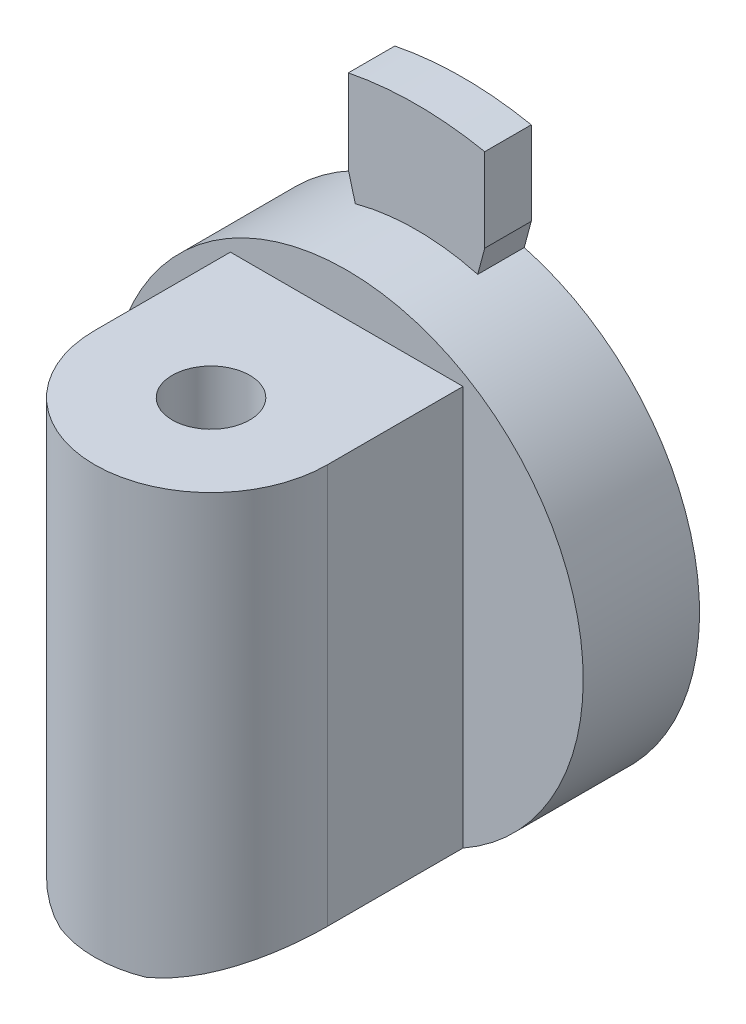
ISO-10303-21;
HEADER;
FILE_DESCRIPTION(('STEP AP214'),'2;1');
FILE_NAME('part.step','',(''),(''),'','','');
FILE_SCHEMA(('AUTOMOTIVE_DESIGN { 1 0 10303 214 1 1 1 1 }'));
ENDSEC;
DATA;
#1=APPLICATION_CONTEXT('core data for automotive mechanical design processes');
#2=APPLICATION_PROTOCOL_DEFINITION('international standard','automotive_design',2000,#1);
#3=PRODUCT_CONTEXT('',#1,'mechanical');
#4=PRODUCT('Part','Part','',(#3));
#5=PRODUCT_RELATED_PRODUCT_CATEGORY('part','',(#4));
#6=PRODUCT_DEFINITION_FORMATION('','',#4);
#7=PRODUCT_DEFINITION_CONTEXT('part definition',#1,'design');
#8=PRODUCT_DEFINITION('design','',#6,#7);
#9=PRODUCT_DEFINITION_SHAPE('','',#8);
#10=(LENGTH_UNIT() NAMED_UNIT(*) SI_UNIT(.MILLI.,.METRE.));
#11=(NAMED_UNIT(*) PLANE_ANGLE_UNIT() SI_UNIT($,.RADIAN.));
#12=(NAMED_UNIT(*) SI_UNIT($,.STERADIAN.) SOLID_ANGLE_UNIT());
#13=UNCERTAINTY_MEASURE_WITH_UNIT(LENGTH_MEASURE(1.E-05),#10,'distance_accuracy_value','');
#14=(GEOMETRIC_REPRESENTATION_CONTEXT(3) GLOBAL_UNCERTAINTY_ASSIGNED_CONTEXT((#13)) GLOBAL_UNIT_ASSIGNED_CONTEXT((#10,
#11,#12)) REPRESENTATION_CONTEXT('',''));
#15=CARTESIAN_POINT('',(0.,0.,0.));
#16=DIRECTION('',(0.,0.,1.));
#17=DIRECTION('',(1.,0.,0.));
#18=AXIS2_PLACEMENT_3D('',#15,#16,#17);
#19=CARTESIAN_POINT('',(0.,-30.5,32.5));
#20=DIRECTION('',(0.,1.,0.));
#21=DIRECTION('',(0.,0.,1.));
#22=AXIS2_PLACEMENT_3D('',#19,#20,#21);
#23=CYLINDRICAL_SURFACE('',#22,5.);
#24=CARTESIAN_POINT('',(0.,-30.,32.5));
#25=DIRECTION('',(0.,1.,0.));
#26=DIRECTION('',(0.,0.,1.));
#27=AXIS2_PLACEMENT_3D('',#24,#25,#26);
#28=CIRCLE('',#27,5.);
#29=CARTESIAN_POINT('',(0.,-30.,37.5));
#30=VERTEX_POINT('',#29);
#31=EDGE_CURVE('E161',#30,#30,#28,.F.);
#32=ORIENTED_EDGE('',*,*,#31,.T.);
#33=EDGE_LOOP('',(#32));
#34=FACE_BOUND('',#33,.T.);
#35=CARTESIAN_POINT('',(0.,25.,32.5));
#36=DIRECTION('',(0.,1.,0.));
#37=DIRECTION('',(0.,0.,1.));
#38=AXIS2_PLACEMENT_3D('',#35,#36,#37);
#39=CIRCLE('',#38,5.);
#40=CARTESIAN_POINT('',(0.,25.,37.5));
#41=VERTEX_POINT('',#40);
#42=EDGE_CURVE('E20',#41,#41,#39,.T.);
#43=ORIENTED_EDGE('',*,*,#42,.T.);
#44=EDGE_LOOP('',(#43));
#45=FACE_BOUND('',#44,.T.);
#46=ADVANCED_FACE('F17',(#34,#45),#23,.F.);
#47=CARTESIAN_POINT('',(-15.,25.,47.5));
#48=DIRECTION('',(0.,-1.,0.));
#49=DIRECTION('',(0.,0.,-1.));
#50=AXIS2_PLACEMENT_3D('',#47,#48,#49);
#51=PLANE('',#50);
#52=DIRECTION('',(1.,0.,0.));
#53=VECTOR('',#52,1.);
#54=CARTESIAN_POINT('',(0.,25.,15.));
#55=LINE('',#54,#53);
#56=CARTESIAN_POINT('',(-15.,25.,15.));
#57=VERTEX_POINT('',#56);
#58=CARTESIAN_POINT('',(15.,25.,15.));
#59=VERTEX_POINT('',#58);
#60=EDGE_CURVE('E159',#57,#59,#55,.T.);
#61=ORIENTED_EDGE('',*,*,#60,.F.);
#62=DIRECTION('',(0.,0.,-1.));
#63=VECTOR('',#62,1.);
#64=CARTESIAN_POINT('',(-15.,25.,47.5));
#65=LINE('',#64,#63);
#66=CARTESIAN_POINT('',(-15.,25.,32.5));
#67=VERTEX_POINT('',#66);
#68=EDGE_CURVE('E206',#57,#67,#65,.F.);
#69=ORIENTED_EDGE('',*,*,#68,.T.);
#70=CARTESIAN_POINT('',(0.,25.,32.5));
#71=DIRECTION('',(0.,-1.,0.));
#72=DIRECTION('',(0.,0.,-1.));
#73=AXIS2_PLACEMENT_3D('',#70,#71,#72);
#74=CIRCLE('',#73,15.);
#75=CARTESIAN_POINT('',(15.,25.,32.5));
#76=VERTEX_POINT('',#75);
#77=EDGE_CURVE('E160',#76,#67,#74,.T.);
#78=ORIENTED_EDGE('',*,*,#77,.F.);
#79=DIRECTION('',(0.,0.,1.));
#80=VECTOR('',#79,1.);
#81=CARTESIAN_POINT('',(15.,25.,47.5));
#82=LINE('',#81,#80);
#83=EDGE_CURVE('E163',#76,#59,#82,.F.);
#84=ORIENTED_EDGE('',*,*,#83,.T.);
#85=EDGE_LOOP('',(#61,#69,#78,#84));
#86=FACE_BOUND('',#85,.T.);
#87=ORIENTED_EDGE('',*,*,#42,.F.);
#88=EDGE_LOOP('',(#87));
#89=FACE_BOUND('',#88,.T.);
#90=ADVANCED_FACE('F252',(#86,#89),#51,.F.);
#91=CARTESIAN_POINT('',(15.,-81.2079095453037,6.));
#92=DIRECTION('',(0.,0.,-1.));
#93=DIRECTION('',(-1.,0.,0.));
#94=AXIS2_PLACEMENT_3D('',#91,#92,#93);
#95=PLANE('',#94);
#96=CARTESIAN_POINT('',(0.,0.,6.));
#97=DIRECTION('',(0.,0.,1.));
#98=DIRECTION('',(1.,0.,0.));
#99=AXIS2_PLACEMENT_3D('',#96,#97,#98);
#100=CIRCLE('',#99,11.5);
#101=CARTESIAN_POINT('',(11.5,0.,6.));
#102=VERTEX_POINT('',#101);
#103=EDGE_CURVE('E156',#102,#102,#100,.F.);
#104=ORIENTED_EDGE('',*,*,#103,.T.);
#105=EDGE_LOOP('',(#104));
#106=FACE_BOUND('',#105,.T.);
#107=ADVANCED_FACE('F421',(#106),#95,.T.);
#108=CARTESIAN_POINT('',(15.,-25.,47.5));
#109=DIRECTION('',(-1.,0.,0.));
#110=DIRECTION('',(0.,0.,1.));
#111=AXIS2_PLACEMENT_3D('',#108,#109,#110);
#112=PLANE('',#111);
#113=DIRECTION('',(0.,1.,0.));
#114=VECTOR('',#113,1.);
#115=CARTESIAN_POINT('',(15.,0.,15.));
#116=LINE('',#115,#114);
#117=CARTESIAN_POINT('',(15.,-26.556543449779,15.));
#118=VERTEX_POINT('',#117);
#119=EDGE_CURVE('E202',#59,#118,#116,.F.);
#120=ORIENTED_EDGE('',*,*,#119,.F.);
#121=ORIENTED_EDGE('',*,*,#83,.F.);
#122=DIRECTION('',(0.,-1.,0.));
#123=VECTOR('',#122,1.);
#124=CARTESIAN_POINT('',(15.,-25.,32.5));
#125=LINE('',#124,#123);
#126=CARTESIAN_POINT('',(15.,-26.556543449779,32.5));
#127=VERTEX_POINT('',#126);
#128=EDGE_CURVE('E113',#127,#76,#125,.F.);
#129=ORIENTED_EDGE('',*,*,#128,.F.);
#130=DIRECTION('',(0.,0.,1.));
#131=VECTOR('',#130,1.);
#132=CARTESIAN_POINT('',(15.,-26.556543449779,-85.5353147287484));
#133=LINE('',#132,#131);
#134=EDGE_CURVE('E151',#118,#127,#133,.T.);
#135=ORIENTED_EDGE('',*,*,#134,.F.);
#136=EDGE_LOOP('',(#120,#121,#129,#135));
#137=FACE_BOUND('',#136,.T.);
#138=ADVANCED_FACE('F208',(#137),#112,.F.);
#139=CARTESIAN_POINT('',(0.,0.,15.));
#140=DIRECTION('',(0.,0.,1.));
#141=DIRECTION('',(1.,0.,0.));
#142=AXIS2_PLACEMENT_3D('',#139,#140,#141);
#143=PLANE('',#142);
#144=DIRECTION('',(1.,0.,0.));
#145=VECTOR('',#144,1.);
#146=CARTESIAN_POINT('',(-15.,-30.,15.));
#147=LINE('',#146,#145);
#148=CARTESIAN_POINT('',(5.49999999999999,-30.,15.));
#149=VERTEX_POINT('',#148);
#150=CARTESIAN_POINT('',(-5.50000000000001,-30.,15.));
#151=VERTEX_POINT('',#150);
#152=EDGE_CURVE('E114',#149,#151,#147,.F.);
#153=ORIENTED_EDGE('',*,*,#152,.T.);
#154=CARTESIAN_POINT('',(0.,0.,15.));
#155=DIRECTION('',(0.,0.,1.));
#156=DIRECTION('',(1.,0.,0.));
#157=AXIS2_PLACEMENT_3D('',#154,#155,#156);
#158=CIRCLE('',#157,30.5);
#159=EDGE_CURVE('E100',#149,#151,#158,.F.);
#160=ORIENTED_EDGE('',*,*,#159,.F.);
#161=EDGE_LOOP('',(#153,#160));
#162=FACE_BOUND('',#161,.T.);
#163=ADVANCED_FACE('F407',(#162),#143,.T.);
#164=CARTESIAN_POINT('',(-15.,-30.,47.5));
#165=DIRECTION('',(0.,1.,0.));
#166=DIRECTION('',(0.,0.,1.));
#167=AXIS2_PLACEMENT_3D('',#164,#165,#166);
#168=PLANE('',#167);
#169=ORIENTED_EDGE('',*,*,#152,.F.);
#170=DIRECTION('',(0.,0.,1.));
#171=VECTOR('',#170,1.);
#172=CARTESIAN_POINT('',(5.49999999999998,-30.,-85.5353147287484));
#173=LINE('',#172,#171);
#174=CARTESIAN_POINT('',(5.49999999999999,-30.,46.4552857369529));
#175=VERTEX_POINT('',#174);
#176=EDGE_CURVE('E109',#175,#149,#173,.F.);
#177=ORIENTED_EDGE('',*,*,#176,.F.);
#178=CARTESIAN_POINT('',(0.,-30.,32.5));
#179=DIRECTION('',(0.,-1.,0.));
#180=DIRECTION('',(0.,0.,-1.));
#181=AXIS2_PLACEMENT_3D('',#178,#179,#180);
#182=CIRCLE('',#181,15.);
#183=CARTESIAN_POINT('',(-5.50000000000001,-30.,46.4552857369529));
#184=VERTEX_POINT('',#183);
#185=EDGE_CURVE('E106',#184,#175,#182,.F.);
#186=ORIENTED_EDGE('',*,*,#185,.F.);
#187=DIRECTION('',(0.,0.,1.));
#188=VECTOR('',#187,1.);
#189=CARTESIAN_POINT('',(-5.50000000000002,-30.,-85.5353147287484));
#190=LINE('',#189,#188);
#191=EDGE_CURVE('E91',#151,#184,#190,.T.);
#192=ORIENTED_EDGE('',*,*,#191,.F.);
#193=EDGE_LOOP('',(#169,#177,#186,#192));
#194=FACE_BOUND('',#193,.T.);
#195=ORIENTED_EDGE('',*,*,#31,.F.);
#196=EDGE_LOOP('',(#195));
#197=FACE_BOUND('',#196,.T.);
#198=ADVANCED_FACE('F107',(#194,#197),#168,.F.);
#199=CARTESIAN_POINT('',(0.,-25.,32.5));
#200=DIRECTION('',(0.,-1.,0.));
#201=DIRECTION('',(0.,0.,-1.));
#202=AXIS2_PLACEMENT_3D('',#199,#200,#201);
#203=CYLINDRICAL_SURFACE('',#202,15.);
#204=DIRECTION('',(0.,1.,0.));
#205=VECTOR('',#204,1.);
#206=CARTESIAN_POINT('',(-15.,-25.,32.5));
#207=LINE('',#206,#205);
#208=CARTESIAN_POINT('',(-15.,-26.556543449779,32.5));
#209=VERTEX_POINT('',#208);
#210=EDGE_CURVE('E118',#67,#209,#207,.F.);
#211=ORIENTED_EDGE('',*,*,#210,.T.);
#212=CARTESIAN_POINT('',(-5.49999999999999,-30.,46.4552857369529));
#213=CARTESIAN_POINT('',(-5.70044985836832,-29.9632528226234,46.3762850100265));
#214=CARTESIAN_POINT('',(-5.89889345198913,-29.9247925311471,46.2930852281892));
#215=CARTESIAN_POINT('',(-6.29147823559979,-29.8447217559978,46.1184969610443));
#216=CARTESIAN_POINT('',(-6.48561976738469,-29.8031115237534,46.0271091292006));
#217=CARTESIAN_POINT('',(-7.06091239412674,-29.6740261090525,45.7411026783285));
#218=CARTESIAN_POINT('',(-7.43523701078017,-29.5822395238018,45.5345204056515));
#219=CARTESIAN_POINT('',(-8.1625106605726,-29.3898747989376,45.0918384437258));
#220=CARTESIAN_POINT('',(-8.5154980358344,-29.289313273663,44.8557941875271));
#221=CARTESIAN_POINT('',(-9.19908617778836,-29.0818568888372,44.3556391888543));
#222=CARTESIAN_POINT('',(-9.52968390522069,-28.9749611731355,44.0915246484606));
#223=CARTESIAN_POINT('',(-10.1661570348007,-28.7578185102687,43.5375241654286));
#224=CARTESIAN_POINT('',(-10.4720777693883,-28.6475782448969,43.2476876326552));
#225=CARTESIAN_POINT('',(-11.0583504910374,-28.4264145970591,42.6434745878344));
#226=CARTESIAN_POINT('',(-11.3387031845262,-28.315491233557,42.3290987542366));
#227=CARTESIAN_POINT('',(-11.8726525672948,-28.0957927821626,41.6770308988742));
#228=CARTESIAN_POINT('',(-12.1262180312078,-27.987020318957,41.3393124090132));
#229=CARTESIAN_POINT('',(-12.6046602008486,-27.7748274075852,40.6425503236751));
#230=CARTESIAN_POINT('',(-12.8295381675375,-27.6714067243001,40.2835076665208));
#231=CARTESIAN_POINT('',(-13.2554739598641,-27.4699769646675,39.5344649560936));
#232=CARTESIAN_POINT('',(-13.455581253173,-27.3722337834306,39.1438511892997));
#233=CARTESIAN_POINT('',(-13.821733707463,-27.1891819657233,38.3440665128642));
#234=CARTESIAN_POINT('',(-13.9877741390536,-27.1038750562148,37.9348930362541));
#235=CARTESIAN_POINT('',(-14.2834948995767,-26.9492039208483,37.1018070341786));
#236=CARTESIAN_POINT('',(-14.4132631740795,-26.8798012086244,36.6779330094969));
#237=CARTESIAN_POINT('',(-14.6351385910958,-26.7596465418452,35.8180896016637));
#238=CARTESIAN_POINT('',(-14.7272679807916,-26.7088835717153,35.3821275266004));
#239=CARTESIAN_POINT('',(-14.8662705636765,-26.6317437671069,34.5396566380537));
#240=CARTESIAN_POINT('',(-14.9163548252856,-26.6036449419356,34.1338398768887));
#241=CARTESIAN_POINT('',(-14.9665033484644,-26.5754416372208,33.5225617200383));
#242=CARTESIAN_POINT('',(-14.9790565482102,-26.5683646851908,33.3183649162622));
#243=CARTESIAN_POINT('',(-14.9958072165998,-26.5589121342893,32.9094552199357));
#244=CARTESIAN_POINT('',(-15.0000020174253,-26.5565380364675,32.7047421834833));
#245=CARTESIAN_POINT('',(-15.,-26.556543449779,32.5));
#246=B_SPLINE_CURVE_WITH_KNOTS('',3,(#212,#213,#214,#215,#216,#217,#218,#219,#220,#221,#222,
#223,#224,#225,#226,#227,#228,#229,#230,#231,#232,#233,#234,#235,#236,#237,#238,#239,#240,#241,
#242,#243,#244,#245),.UNSPECIFIED.,.F.,.F.,(4,2,2,2,2,2,2,2,2,2,2,2,2,2,2,2,4),(0.,
0.6555807362847,1.31110919914286,2.62116971136201,3.92880147213482,5.23661038173218,
6.54195933318409,7.84727220781192,9.15409025063843,10.4608508323729,11.8079824941131,
13.1553010473637,14.4993239773688,15.8425513435751,17.0702417680146,17.6841581877522,
18.2982705248266),.UNSPECIFIED.);
#247=EDGE_CURVE('E96',#184,#209,#246,.T.);
#248=ORIENTED_EDGE('',*,*,#247,.F.);
#249=ORIENTED_EDGE('',*,*,#185,.T.);
#250=CARTESIAN_POINT('',(15.,-26.556543449779,32.5));
#251=CARTESIAN_POINT('',(15.0000014026638,-26.5565390738362,32.6969364044512));
#252=CARTESIAN_POINT('',(14.9961207625379,-26.5587350050204,32.8938451348109));
#253=CARTESIAN_POINT('',(14.9806203400195,-26.5674825610559,33.2872530279762));
#254=CARTESIAN_POINT('',(14.9690008717466,-26.5740340091163,33.4837522070808));
#255=CARTESIAN_POINT('',(14.9225967123751,-26.6001401494794,34.0718043514932));
#256=CARTESIAN_POINT('',(14.8762661766994,-26.6261467846204,34.4622381680938));
#257=CARTESIAN_POINT('',(14.7537894694636,-26.6942039566186,35.2345486714711));
#258=CARTESIAN_POINT('',(14.6778185255595,-26.7361601663379,35.6164619531654));
#259=CARTESIAN_POINT('',(14.4969727664112,-26.8346486110775,36.3714957648628));
#260=CARTESIAN_POINT('',(14.3920948187284,-26.8911824257224,36.7446153371973));
#261=CARTESIAN_POINT('',(14.1548320157859,-27.0168222535819,37.4788855636498));
#262=CARTESIAN_POINT('',(14.0225065630935,-27.0859010770394,37.8400601438407));
#263=CARTESIAN_POINT('',(13.7314461960114,-27.2346116805776,38.5493255395646));
#264=CARTESIAN_POINT('',(13.572711507314,-27.3142433704728,38.897416466879));
#265=CARTESIAN_POINT('',(13.2298066596243,-27.4819701843651,39.5794162586463));
#266=CARTESIAN_POINT('',(13.0455963684955,-27.5700785938852,39.9133016377761));
#267=CARTESIAN_POINT('',(12.6530870268278,-27.752409345025,40.5649951605157));
#268=CARTESIAN_POINT('',(12.4447792424838,-27.8466338978922,40.8827974146518));
#269=CARTESIAN_POINT('',(11.9878440760027,-28.0465434790923,41.5254713768917));
#270=CARTESIAN_POINT('',(11.7373290757234,-28.1525446897317,41.8489039128868));
#271=CARTESIAN_POINT('',(11.2110354854341,-28.3662359408782,42.4739469112018));
#272=CARTESIAN_POINT('',(10.9352549698111,-28.47392610959,42.775555707083));
#273=CARTESIAN_POINT('',(10.3600690103158,-28.6882045071982,43.3552080437725));
#274=CARTESIAN_POINT('',(10.0606840138916,-28.7947936013008,43.6332715568982));
#275=CARTESIAN_POINT('',(9.43960096738987,-29.0043317009754,44.1645109166751));
#276=CARTESIAN_POINT('',(9.11791285702915,-29.1072822976044,44.4176977299329));
#277=CARTESIAN_POINT('',(8.53392604028819,-29.2829529684143,44.8397209588349));
#278=CARTESIAN_POINT('',(8.2760456443755,-29.3569695501431,45.0141618565917));
#279=CARTESIAN_POINT('',(7.74905691851303,-29.5004521386522,45.3471489899896));
#280=CARTESIAN_POINT('',(7.47995090233456,-29.5699190756713,45.5056984783913));
#281=CARTESIAN_POINT('',(6.93122407218257,-29.7033298299006,45.8062386575715));
#282=CARTESIAN_POINT('',(6.6516006734242,-29.7672722764952,45.9482252421674));
#283=CARTESIAN_POINT('',(6.08274625864676,-29.8887115677558,46.2149190584511));
#284=CARTESIAN_POINT('',(5.79351164790619,-29.9462059647774,46.3396197327122));
#285=CARTESIAN_POINT('',(5.49999999999998,-30.,46.4552857369529));
#286=B_SPLINE_CURVE_WITH_KNOTS('',3,(#250,#251,#252,#253,#254,#255,#256,#257,#258,#259,#260,
#261,#262,#263,#264,#265,#266,#267,#268,#269,#270,#271,#272,#273,#274,#275,#276,#277,#278,#279,
#280,#281,#282,#283,#284,#285),.UNSPECIFIED.,.F.,.F.,(4,2,2,2,2,2,2,2,2,2,2,2,2,2,2,2,2,4),(0.,
0.590704058680019,1.18138414209215,2.36176917596571,3.53527926211263,4.70891656291603,
5.88003986654682,7.05115316231762,8.22413280472118,9.39753891734263,10.6640308823157,
11.9306194534928,13.1961226456296,14.4610654283574,15.4205340555209,16.3798058894005,
17.3393150374291,18.2991871858487),.UNSPECIFIED.);
#287=EDGE_CURVE('E145',#127,#175,#286,.T.);
#288=ORIENTED_EDGE('',*,*,#287,.F.);
#289=ORIENTED_EDGE('',*,*,#128,.T.);
#290=ORIENTED_EDGE('',*,*,#77,.T.);
#291=EDGE_LOOP('',(#211,#248,#249,#288,#289,#290));
#292=FACE_BOUND('',#291,.T.);
#293=ADVANCED_FACE('F116',(#292),#203,.T.);
#294=CARTESIAN_POINT('',(-15.,-25.,47.5));
#295=DIRECTION('',(1.,0.,0.));
#296=DIRECTION('',(0.,0.,-1.));
#297=AXIS2_PLACEMENT_3D('',#294,#295,#296);
#298=PLANE('',#297);
#299=DIRECTION('',(0.,1.,0.));
#300=VECTOR('',#299,1.);
#301=CARTESIAN_POINT('',(-15.,0.,15.));
#302=LINE('',#301,#300);
#303=CARTESIAN_POINT('',(-15.,-26.556543449779,15.));
#304=VERTEX_POINT('',#303);
#305=EDGE_CURVE('E205',#304,#57,#302,.T.);
#306=ORIENTED_EDGE('',*,*,#305,.F.);
#307=DIRECTION('',(0.,0.,1.));
#308=VECTOR('',#307,1.);
#309=CARTESIAN_POINT('',(-15.,-26.556543449779,-85.5353147287484));
#310=LINE('',#309,#308);
#311=EDGE_CURVE('E120',#209,#304,#310,.F.);
#312=ORIENTED_EDGE('',*,*,#311,.F.);
#313=ORIENTED_EDGE('',*,*,#210,.F.);
#314=ORIENTED_EDGE('',*,*,#68,.F.);
#315=EDGE_LOOP('',(#306,#312,#313,#314));
#316=FACE_BOUND('',#315,.T.);
#317=ADVANCED_FACE('F141',(#316),#298,.F.);
#318=CARTESIAN_POINT('',(0.,0.,15.));
#319=DIRECTION('',(0.,0.,1.));
#320=DIRECTION('',(1.,0.,0.));
#321=AXIS2_PLACEMENT_3D('',#318,#319,#320);
#322=PLANE('',#321);
#323=ORIENTED_EDGE('',*,*,#305,.T.);
#324=ORIENTED_EDGE('',*,*,#60,.T.);
#325=ORIENTED_EDGE('',*,*,#119,.T.);
#326=CARTESIAN_POINT('',(0.,0.,15.));
#327=DIRECTION('',(0.,0.,1.));
#328=DIRECTION('',(1.,0.,0.));
#329=AXIS2_PLACEMENT_3D('',#326,#327,#328);
#330=CIRCLE('',#329,30.5);
#331=EDGE_CURVE('E122',#304,#118,#330,.F.);
#332=ORIENTED_EDGE('',*,*,#331,.F.);
#333=EDGE_LOOP('',(#323,#324,#325,#332));
#334=FACE_BOUND('',#333,.T.);
#335=ADVANCED_FACE('F203',(#334),#322,.T.);
#336=CARTESIAN_POINT('',(-35.8,46.3,6.));
#337=DIRECTION('',(0.,0.,1.));
#338=DIRECTION('',(1.,0.,0.));
#339=AXIS2_PLACEMENT_3D('',#336,#337,#338);
#340=PLANE('',#339);
#341=DIRECTION('',(0.,1.,0.));
#342=VECTOR('',#341,1.);
#343=CARTESIAN_POINT('',(-8.8,40.0000000000061,6.));
#344=LINE('',#343,#342);
#345=CARTESIAN_POINT('',(-8.8,43.6212104371256,6.));
#346=VERTEX_POINT('',#345);
#347=CARTESIAN_POINT('',(-8.80000000000001,32.8420471066061,6.));
#348=VERTEX_POINT('',#347);
#349=EDGE_CURVE('E222',#346,#348,#344,.F.);
#350=ORIENTED_EDGE('',*,*,#349,.T.);
#351=DIRECTION('',(0.258819045102522,-0.965925826289068,0.));
#352=VECTOR('',#351,1.);
#353=CARTESIAN_POINT('',(0.,0.,6.));
#354=LINE('',#353,#352);
#355=CARTESIAN_POINT('',(-7.8939808756269,29.4607377018166,6.00000000000001));
#356=VERTEX_POINT('',#355);
#357=EDGE_CURVE('E213',#356,#348,#354,.F.);
#358=ORIENTED_EDGE('',*,*,#357,.F.);
#359=CARTESIAN_POINT('',(0.,0.,6.00000000000001));
#360=DIRECTION('',(0.,0.,1.));
#361=DIRECTION('',(1.,0.,0.));
#362=AXIS2_PLACEMENT_3D('',#359,#360,#361);
#363=CIRCLE('',#362,30.5);
#364=CARTESIAN_POINT('',(7.89398087562691,29.4607377018166,6.));
#365=VERTEX_POINT('',#364);
#366=EDGE_CURVE('E190',#365,#356,#363,.T.);
#367=ORIENTED_EDGE('',*,*,#366,.F.);
#368=DIRECTION('',(-0.258819045102522,-0.965925826289068,0.));
#369=VECTOR('',#368,1.);
#370=CARTESIAN_POINT('',(0.,0.,6.));
#371=LINE('',#370,#369);
#372=CARTESIAN_POINT('',(8.8,32.842047106606,6.));
#373=VERTEX_POINT('',#372);
#374=EDGE_CURVE('E189',#365,#373,#371,.F.);
#375=ORIENTED_EDGE('',*,*,#374,.T.);
#376=DIRECTION('',(0.,-1.,0.));
#377=VECTOR('',#376,1.);
#378=CARTESIAN_POINT('',(8.8,40.0000000000061,6.));
#379=LINE('',#378,#377);
#380=CARTESIAN_POINT('',(8.8,43.6212104371256,6.));
#381=VERTEX_POINT('',#380);
#382=EDGE_CURVE('E155',#373,#381,#379,.F.);
#383=ORIENTED_EDGE('',*,*,#382,.T.);
#384=CARTESIAN_POINT('',(0.,0.,6.));
#385=DIRECTION('',(0.,0.,-1.));
#386=DIRECTION('',(-1.,0.,0.));
#387=AXIS2_PLACEMENT_3D('',#384,#385,#386);
#388=CIRCLE('',#387,44.5);
#389=EDGE_CURVE('E152',#346,#381,#388,.T.);
#390=ORIENTED_EDGE('',*,*,#389,.F.);
#391=EDGE_LOOP('',(#350,#358,#367,#375,#383,#390));
#392=FACE_BOUND('',#391,.T.);
#393=ADVANCED_FACE('F304',(#392),#340,.T.);
#394=CARTESIAN_POINT('',(0.,0.,0.));
#395=DIRECTION('',(0.,0.,1.));
#396=DIRECTION('',(1.,0.,0.));
#397=AXIS2_PLACEMENT_3D('',#394,#395,#396);
#398=CYLINDRICAL_SURFACE('',#397,11.5);
#399=CARTESIAN_POINT('',(0.,0.,0.));
#400=DIRECTION('',(0.,0.,1.));
#401=DIRECTION('',(1.,0.,0.));
#402=AXIS2_PLACEMENT_3D('',#399,#400,#401);
#403=CIRCLE('',#402,11.5);
#404=CARTESIAN_POINT('',(11.5,0.,0.));
#405=VERTEX_POINT('',#404);
#406=EDGE_CURVE('E187',#405,#405,#403,.F.);
#407=ORIENTED_EDGE('',*,*,#406,.T.);
#408=EDGE_LOOP('',(#407));
#409=FACE_BOUND('',#408,.T.);
#410=ORIENTED_EDGE('',*,*,#103,.F.);
#411=EDGE_LOOP('',(#410));
#412=FACE_BOUND('',#411,.T.);
#413=ADVANCED_FACE('F306',(#409,#412),#398,.F.);
#414=CARTESIAN_POINT('',(8.8,40.0000000000061,0.));
#415=DIRECTION('',(-1.,0.,0.));
#416=DIRECTION('',(0.,-1.,0.));
#417=AXIS2_PLACEMENT_3D('',#414,#415,#416);
#418=PLANE('',#417);
#419=DIRECTION('',(0.,0.,1.));
#420=VECTOR('',#419,1.);
#421=CARTESIAN_POINT('',(8.8,32.842047106606,37.2734992977005));
#422=LINE('',#421,#420);
#423=CARTESIAN_POINT('',(8.8,32.8420471066061,0.));
#424=VERTEX_POINT('',#423);
#425=EDGE_CURVE('E193',#373,#424,#422,.F.);
#426=ORIENTED_EDGE('',*,*,#425,.T.);
#427=DIRECTION('',(0.,1.,0.));
#428=VECTOR('',#427,1.);
#429=CARTESIAN_POINT('',(8.8,0.,0.));
#430=LINE('',#429,#428);
#431=CARTESIAN_POINT('',(8.8,43.6212104371256,0.));
#432=VERTEX_POINT('',#431);
#433=EDGE_CURVE('E186',#424,#432,#430,.T.);
#434=ORIENTED_EDGE('',*,*,#433,.T.);
#435=DIRECTION('',(0.,0.,-1.));
#436=VECTOR('',#435,1.);
#437=CARTESIAN_POINT('',(8.80000000000001,43.6212104371256,37.2734992977005));
#438=LINE('',#437,#436);
#439=EDGE_CURVE('E154',#381,#432,#438,.T.);
#440=ORIENTED_EDGE('',*,*,#439,.F.);
#441=ORIENTED_EDGE('',*,*,#382,.F.);
#442=EDGE_LOOP('',(#426,#434,#440,#441));
#443=FACE_BOUND('',#442,.T.);
#444=ADVANCED_FACE('F273',(#443),#418,.F.);
#445=CARTESIAN_POINT('',(0.,0.,37.2734992977005));
#446=DIRECTION('',(0.,0.,-1.));
#447=DIRECTION('',(-1.,0.,0.));
#448=AXIS2_PLACEMENT_3D('',#445,#446,#447);
#449=CYLINDRICAL_SURFACE('',#448,44.5);
#450=ORIENTED_EDGE('',*,*,#439,.T.);
#451=CARTESIAN_POINT('',(0.,0.,0.));
#452=DIRECTION('',(0.,0.,-1.));
#453=DIRECTION('',(-1.,0.,0.));
#454=AXIS2_PLACEMENT_3D('',#451,#452,#453);
#455=CIRCLE('',#454,44.5);
#456=CARTESIAN_POINT('',(-8.8,43.6212104371256,0.));
#457=VERTEX_POINT('',#456);
#458=EDGE_CURVE('E182',#432,#457,#455,.F.);
#459=ORIENTED_EDGE('',*,*,#458,.T.);
#460=DIRECTION('',(0.,0.,1.));
#461=VECTOR('',#460,1.);
#462=CARTESIAN_POINT('',(-8.8,43.6212104371256,0.));
#463=LINE('',#462,#461);
#464=EDGE_CURVE('E219',#457,#346,#463,.T.);
#465=ORIENTED_EDGE('',*,*,#464,.T.);
#466=ORIENTED_EDGE('',*,*,#389,.T.);
#467=EDGE_LOOP('',(#450,#459,#465,#466));
#468=FACE_BOUND('',#467,.T.);
#469=ADVANCED_FACE('F302',(#468),#449,.T.);
#470=CARTESIAN_POINT('',(-8.8,40.0000000000061,0.));
#471=DIRECTION('',(1.,0.,0.));
#472=DIRECTION('',(0.,1.,0.));
#473=AXIS2_PLACEMENT_3D('',#470,#471,#472);
#474=PLANE('',#473);
#475=ORIENTED_EDGE('',*,*,#464,.F.);
#476=DIRECTION('',(0.,1.,0.));
#477=VECTOR('',#476,1.);
#478=CARTESIAN_POINT('',(-8.8,0.,0.));
#479=LINE('',#478,#477);
#480=CARTESIAN_POINT('',(-8.8,32.842047106606,0.));
#481=VERTEX_POINT('',#480);
#482=EDGE_CURVE('E185',#457,#481,#479,.F.);
#483=ORIENTED_EDGE('',*,*,#482,.T.);
#484=DIRECTION('',(0.,0.,1.));
#485=VECTOR('',#484,1.);
#486=CARTESIAN_POINT('',(-8.80000000000001,32.8420471066061,37.2734992977005));
#487=LINE('',#486,#485);
#488=EDGE_CURVE('E210',#348,#481,#487,.F.);
#489=ORIENTED_EDGE('',*,*,#488,.F.);
#490=ORIENTED_EDGE('',*,*,#349,.F.);
#491=EDGE_LOOP('',(#475,#483,#489,#490));
#492=FACE_BOUND('',#491,.T.);
#493=ADVANCED_FACE('F299',(#492),#474,.F.);
#494=CARTESIAN_POINT('',(0.,0.,37.2734992977005));
#495=DIRECTION('',(-0.965925826289068,-0.258819045102522,0.));
#496=DIRECTION('',(0.258819045102522,-0.965925826289068,0.));
#497=AXIS2_PLACEMENT_3D('',#494,#495,#496);
#498=PLANE('',#497);
#499=ORIENTED_EDGE('',*,*,#488,.T.);
#500=DIRECTION('',(0.258819045102522,-0.965925826289068,0.));
#501=VECTOR('',#500,1.);
#502=CARTESIAN_POINT('',(-8.8,32.8420471066061,0.));
#503=LINE('',#502,#501);
#504=CARTESIAN_POINT('',(-7.8939808756269,29.4607377018166,0.));
#505=VERTEX_POINT('',#504);
#506=EDGE_CURVE('E181',#481,#505,#503,.T.);
#507=ORIENTED_EDGE('',*,*,#506,.T.);
#508=DIRECTION('',(0.,0.,1.));
#509=VECTOR('',#508,1.);
#510=CARTESIAN_POINT('',(-7.89398087562689,29.4607377018166,-85.5353147287484));
#511=LINE('',#510,#509);
#512=EDGE_CURVE('E191',#356,#505,#511,.F.);
#513=ORIENTED_EDGE('',*,*,#512,.F.);
#514=ORIENTED_EDGE('',*,*,#357,.T.);
#515=EDGE_LOOP('',(#499,#507,#513,#514));
#516=FACE_BOUND('',#515,.T.);
#517=ADVANCED_FACE('F296',(#516),#498,.T.);
#518=CARTESIAN_POINT('',(0.,0.,-85.5353147287484));
#519=DIRECTION('',(0.,0.,1.));
#520=DIRECTION('',(1.,0.,0.));
#521=AXIS2_PLACEMENT_3D('',#518,#519,#520);
#522=CYLINDRICAL_SURFACE('',#521,30.5);
#523=ORIENTED_EDGE('',*,*,#311,.T.);
#524=ORIENTED_EDGE('',*,*,#331,.T.);
#525=ORIENTED_EDGE('',*,*,#134,.T.);
#526=ORIENTED_EDGE('',*,*,#287,.T.);
#527=ORIENTED_EDGE('',*,*,#176,.T.);
#528=ORIENTED_EDGE('',*,*,#159,.T.);
#529=ORIENTED_EDGE('',*,*,#191,.T.);
#530=ORIENTED_EDGE('',*,*,#247,.T.);
#531=EDGE_LOOP('',(#523,#524,#525,#526,#527,#528,#529,#530));
#532=FACE_BOUND('',#531,.T.);
#533=ORIENTED_EDGE('',*,*,#366,.T.);
#534=ORIENTED_EDGE('',*,*,#512,.T.);
#535=CARTESIAN_POINT('',(0.,0.,0.));
#536=DIRECTION('',(0.,0.,1.));
#537=DIRECTION('',(1.,0.,0.));
#538=AXIS2_PLACEMENT_3D('',#535,#536,#537);
#539=CIRCLE('',#538,30.5);
#540=CARTESIAN_POINT('',(7.8939808756269,29.4607377018166,0.));
#541=VERTEX_POINT('',#540);
#542=EDGE_CURVE('E26',#505,#541,#539,.T.);
#543=ORIENTED_EDGE('',*,*,#542,.T.);
#544=DIRECTION('',(0.,0.,1.));
#545=VECTOR('',#544,1.);
#546=CARTESIAN_POINT('',(7.89398087562691,29.4607377018166,37.2734992977005));
#547=LINE('',#546,#545);
#548=EDGE_CURVE('E226',#541,#365,#547,.T.);
#549=ORIENTED_EDGE('',*,*,#548,.T.);
#550=EDGE_LOOP('',(#533,#534,#543,#549));
#551=FACE_BOUND('',#550,.T.);
#552=ADVANCED_FACE('F94',(#532,#551),#522,.T.);
#553=CARTESIAN_POINT('',(0.,0.,37.2734992977005));
#554=DIRECTION('',(-0.965925826289068,0.258819045102522,0.));
#555=DIRECTION('',(-0.258819045102522,-0.965925826289068,0.));
#556=AXIS2_PLACEMENT_3D('',#553,#554,#555);
#557=PLANE('',#556);
#558=ORIENTED_EDGE('',*,*,#548,.F.);
#559=DIRECTION('',(0.258819045102519,0.965925826289069,0.));
#560=VECTOR('',#559,1.);
#561=CARTESIAN_POINT('',(7.8939808756269,29.4607377018166,0.));
#562=LINE('',#561,#560);
#563=EDGE_CURVE('E11',#541,#424,#562,.T.);
#564=ORIENTED_EDGE('',*,*,#563,.T.);
#565=ORIENTED_EDGE('',*,*,#425,.F.);
#566=ORIENTED_EDGE('',*,*,#374,.F.);
#567=EDGE_LOOP('',(#558,#564,#565,#566));
#568=FACE_BOUND('',#567,.T.);
#569=ADVANCED_FACE('F277',(#568),#557,.F.);
#570=CARTESIAN_POINT('',(0.,0.,0.));
#571=DIRECTION('',(0.,0.,1.));
#572=DIRECTION('',(1.,0.,0.));
#573=AXIS2_PLACEMENT_3D('',#570,#571,#572);
#574=PLANE('',#573);
#575=ORIENTED_EDGE('',*,*,#563,.F.);
#576=ORIENTED_EDGE('',*,*,#542,.F.);
#577=ORIENTED_EDGE('',*,*,#506,.F.);
#578=ORIENTED_EDGE('',*,*,#482,.F.);
#579=ORIENTED_EDGE('',*,*,#458,.F.);
#580=ORIENTED_EDGE('',*,*,#433,.F.);
#581=EDGE_LOOP('',(#575,#576,#577,#578,#579,#580));
#582=FACE_BOUND('',#581,.T.);
#583=ORIENTED_EDGE('',*,*,#406,.F.);
#584=EDGE_LOOP('',(#583));
#585=FACE_BOUND('',#584,.T.);
#586=ADVANCED_FACE('F266',(#582,#585),#574,.F.);
#587=CLOSED_SHELL('',(#46,#90,#107,#138,#163,#198,#293,#317,#335,#393,#413,#444,#469,#493,#517,
#552,#569,#586));
#588=MANIFOLD_SOLID_BREP('B1',#587);
#589=ADVANCED_BREP_SHAPE_REPRESENTATION('',(#18,#588),#14);
#590=SHAPE_DEFINITION_REPRESENTATION(#9,#589);
ENDSEC;
END-ISO-10303-21;
